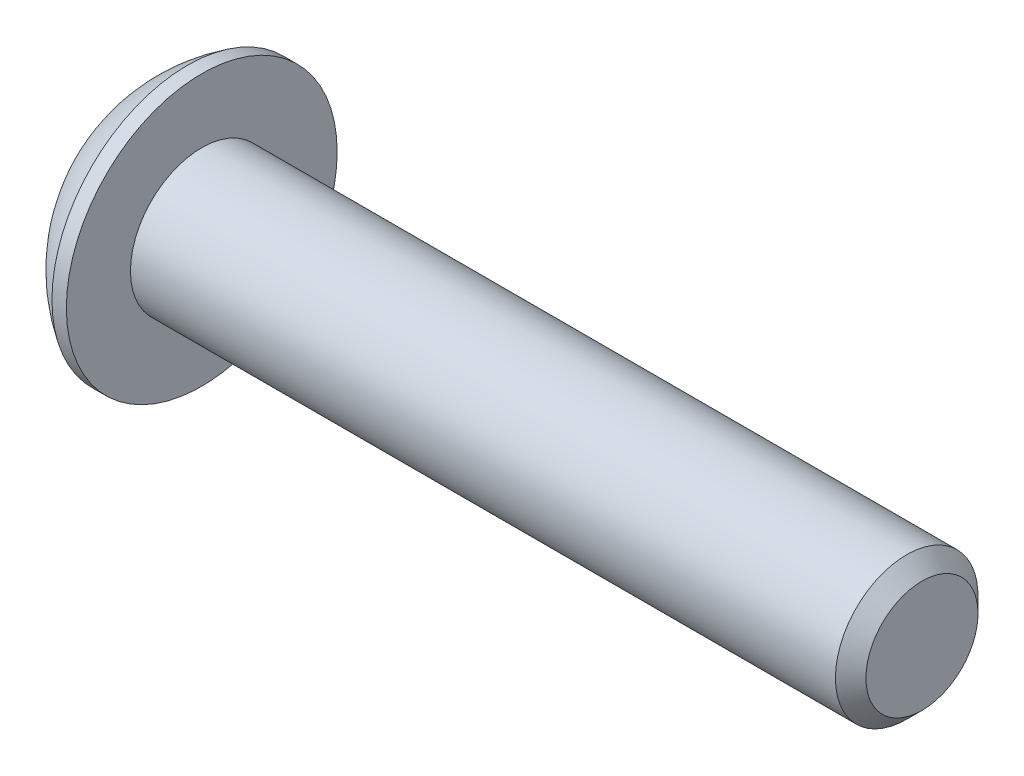
ISO-10303-21;
HEADER;
FILE_DESCRIPTION(('STEP AP214'),'2;1');
FILE_NAME('part.step','',(''),(''),'','','');
FILE_SCHEMA(('AUTOMOTIVE_DESIGN { 1 0 10303 214 1 1 1 1 }'));
ENDSEC;
DATA;
#1=APPLICATION_CONTEXT('core data for automotive mechanical design processes');
#2=APPLICATION_PROTOCOL_DEFINITION('international standard','automotive_design',2000,#1);
#3=PRODUCT_CONTEXT('',#1,'mechanical');
#4=PRODUCT('Part','Part','',(#3));
#5=PRODUCT_RELATED_PRODUCT_CATEGORY('part','',(#4));
#6=PRODUCT_DEFINITION_FORMATION('','',#4);
#7=PRODUCT_DEFINITION_CONTEXT('part definition',#1,'design');
#8=PRODUCT_DEFINITION('design','',#6,#7);
#9=PRODUCT_DEFINITION_SHAPE('','',#8);
#10=(LENGTH_UNIT() NAMED_UNIT(*) SI_UNIT(.MILLI.,.METRE.));
#11=(NAMED_UNIT(*) PLANE_ANGLE_UNIT() SI_UNIT($,.RADIAN.));
#12=(NAMED_UNIT(*) SI_UNIT($,.STERADIAN.) SOLID_ANGLE_UNIT());
#13=UNCERTAINTY_MEASURE_WITH_UNIT(LENGTH_MEASURE(1.E-05),#10,'distance_accuracy_value','');
#14=(GEOMETRIC_REPRESENTATION_CONTEXT(3) GLOBAL_UNCERTAINTY_ASSIGNED_CONTEXT((#13)) GLOBAL_UNIT_ASSIGNED_CONTEXT((#10,
#11,#12)) REPRESENTATION_CONTEXT('',''));
#15=CARTESIAN_POINT('',(0.,0.,0.));
#16=DIRECTION('',(0.,0.,1.));
#17=DIRECTION('',(1.,0.,0.));
#18=AXIS2_PLACEMENT_3D('',#15,#16,#17);
#19=CARTESIAN_POINT('',(0.,0.,0.));
#20=DIRECTION('',(-1.,0.,0.));
#21=DIRECTION('',(0.,0.,1.));
#22=AXIS2_PLACEMENT_3D('',#19,#20,#21);
#23=PLANE('',#22);
#24=CARTESIAN_POINT('',(0.,0.,0.));
#25=DIRECTION('',(-1.,0.,0.));
#26=DIRECTION('',(0.,0.,1.));
#27=AXIS2_PLACEMENT_3D('',#24,#25,#26);
#28=CIRCLE('',#27,1.1938);
#29=CARTESIAN_POINT('',(0.,1.1938,0.));
#30=VERTEX_POINT('',#29);
#31=EDGE_CURVE('E11',#30,#30,#28,.T.);
#32=ORIENTED_EDGE('',*,*,#31,.T.);
#33=EDGE_LOOP('',(#32));
#34=FACE_BOUND('',#33,.T.);
#35=DIRECTION('',(0.,-1.,0.));
#36=VECTOR('',#35,1.);
#37=CARTESIAN_POINT('',(0.,-0.454605601959911,0.787400000000001));
#38=LINE('',#37,#36);
#39=CARTESIAN_POINT('',(0.,0.454605601959914,0.787400000000002));
#40=VERTEX_POINT('',#39);
#41=CARTESIAN_POINT('',(0.,-0.454605601959911,0.787400000000001));
#42=VERTEX_POINT('',#41);
#43=EDGE_CURVE('E51',#40,#42,#38,.T.);
#44=ORIENTED_EDGE('',*,*,#43,.T.);
#45=DIRECTION('',(0.,-0.499999999999998,-0.86602540378444));
#46=VECTOR('',#45,1.);
#47=CARTESIAN_POINT('',(0.,-0.90921120391982,0.));
#48=LINE('',#47,#46);
#49=CARTESIAN_POINT('',(0.,-0.90921120391982,0.));
#50=VERTEX_POINT('',#49);
#51=EDGE_CURVE('E370',#42,#50,#48,.T.);
#52=ORIENTED_EDGE('',*,*,#51,.T.);
#53=DIRECTION('',(0.,0.499999999999999,-0.866025403784439));
#54=VECTOR('',#53,1.);
#55=CARTESIAN_POINT('',(0.,-0.454605601959911,-0.7874));
#56=LINE('',#55,#54);
#57=CARTESIAN_POINT('',(0.,-0.454605601959911,-0.7874));
#58=VERTEX_POINT('',#57);
#59=EDGE_CURVE('E131',#50,#58,#56,.T.);
#60=ORIENTED_EDGE('',*,*,#59,.T.);
#61=DIRECTION('',(0.,1.,0.));
#62=VECTOR('',#61,1.);
#63=CARTESIAN_POINT('',(0.,0.454605601959914,-0.7874));
#64=LINE('',#63,#62);
#65=CARTESIAN_POINT('',(0.,0.454605601959914,-0.7874));
#66=VERTEX_POINT('',#65);
#67=EDGE_CURVE('E373',#58,#66,#64,.T.);
#68=ORIENTED_EDGE('',*,*,#67,.T.);
#69=DIRECTION('',(0.,0.5,0.866025403784439));
#70=VECTOR('',#69,1.);
#71=CARTESIAN_POINT('',(0.,0.909211203919825,0.));
#72=LINE('',#71,#70);
#73=CARTESIAN_POINT('',(0.,0.909211203919825,0.));
#74=VERTEX_POINT('',#73);
#75=EDGE_CURVE('E375',#66,#74,#72,.T.);
#76=ORIENTED_EDGE('',*,*,#75,.T.);
#77=DIRECTION('',(0.,-0.499999999999998,0.86602540378444));
#78=VECTOR('',#77,1.);
#79=CARTESIAN_POINT('',(0.,0.454605601959914,0.787400000000002));
#80=LINE('',#79,#78);
#81=EDGE_CURVE('E377',#74,#40,#80,.T.);
#82=ORIENTED_EDGE('',*,*,#81,.T.);
#83=EDGE_LOOP('',(#44,#52,#60,#68,#76,#82));
#84=FACE_BOUND('',#83,.T.);
#85=ADVANCED_FACE('F37',(#34,#84),#23,.T.);
#86=CARTESIAN_POINT('',(2.53727857142857,0.,0.));
#87=DIRECTION('',(-1.,0.,0.));
#88=DIRECTION('',(0.,1.,0.));
#89=AXIS2_PLACEMENT_3D('',#86,#87,#88);
#90=SPHERICAL_SURFACE('',#89,2.80409361274381);
#91=CARTESIAN_POINT('',(1.0668,0.,0.));
#92=DIRECTION('',(-1.,0.,0.));
#93=DIRECTION('',(0.,0.,1.));
#94=AXIS2_PLACEMENT_3D('',#91,#92,#93);
#95=CIRCLE('',#94,2.3876);
#96=CARTESIAN_POINT('',(1.0668,2.3876,0.));
#97=VERTEX_POINT('',#96);
#98=EDGE_CURVE('E44',#97,#97,#95,.T.);
#99=CARTESIAN_POINT('',(1.0668,2.3876,0.));
#100=CARTESIAN_POINT('',(1.05239959514986,2.37873107877504,0.));
#101=CARTESIAN_POINT('',(1.03807944648218,2.36973184753798,0.));
#102=CARTESIAN_POINT('',(1.0096043070437,2.35147577775036,0.));
#103=CARTESIAN_POINT('',(0.99544931627289,2.3422189391998,0.));
#104=CARTESIAN_POINT('',(0.967309138160108,2.32345066749592,0.));
#105=CARTESIAN_POINT('',(0.953323950818132,2.31393923434259,0.));
#106=CARTESIAN_POINT('',(0.92552795501619,2.29466489209172,0.));
#107=CARTESIAN_POINT('',(0.911717146556223,2.28490198299417,0.));
#108=CARTESIAN_POINT('',(0.884274430764817,2.2651278837873,0.));
#109=CARTESIAN_POINT('',(0.870642523433377,2.25511669367799,0.));
#110=CARTESIAN_POINT('',(0.843562072536132,2.23484931028554,0.));
#111=CARTESIAN_POINT('',(0.830113528970327,2.22459311700241,0.));
#112=CARTESIAN_POINT('',(0.803404208489969,2.20383908487543,0.));
#113=CARTESIAN_POINT('',(0.790143431575416,2.19334124603159,0.));
#114=CARTESIAN_POINT('',(0.763813985736857,2.17210735962349,0.));
#115=CARTESIAN_POINT('',(0.750745316812851,2.16137131205923,0.));
#116=CARTESIAN_POINT('',(0.724804365421771,2.13966452300491,0.));
#117=CARTESIAN_POINT('',(0.711932082954696,2.12869378151484,0.));
#118=CARTESIAN_POINT('',(0.686388118644883,2.1065211962467,0.));
#119=CARTESIAN_POINT('',(0.673716436802143,2.09531935246863,0.));
#120=CARTESIAN_POINT('',(0.648577822236573,2.07268822991904,0.));
#121=CARTESIAN_POINT('',(0.636110889513743,2.06125895114752,0.));
#122=CARTESIAN_POINT('',(0.611385854651764,2.0381767003646,0.));
#123=CARTESIAN_POINT('',(0.599127752512616,2.0265237283532,0.));
#124=CARTESIAN_POINT('',(0.574824391914264,2.00299790607728,0.));
#125=CARTESIAN_POINT('',(0.562779133455059,1.99112505581278,0.));
#126=CARTESIAN_POINT('',(0.538905403631389,1.96716336400193,0.));
#127=CARTESIAN_POINT('',(0.527076932266924,1.95507452245559,0.));
#128=CARTESIAN_POINT('',(0.503640649075091,1.93068480576426,0.));
#129=CARTESIAN_POINT('',(0.492032837247724,1.91838393061926,0.));
#130=CARTESIAN_POINT('',(0.469041673332227,1.89357417383,0.));
#131=CARTESIAN_POINT('',(0.457658321244097,1.88106529218574,0.));
#132=CARTESIAN_POINT('',(0.435119803524877,1.85584361759518,0.));
#133=CARTESIAN_POINT('',(0.423964637893787,1.84313082464889,0.));
#134=CARTESIAN_POINT('',(0.401886145102042,1.81750548940861,0.));
#135=CARTESIAN_POINT('',(0.390962817941387,1.80459294711464,0.));
#136=CARTESIAN_POINT('',(0.369351578203901,1.77857234052793,0.));
#137=CARTESIAN_POINT('',(0.358663665627069,1.76546427623519,0.));
#138=CARTESIAN_POINT('',(0.337526754099839,1.73905691701051,0.));
#139=CARTESIAN_POINT('',(0.327077755149442,1.72575762207855,0.));
#140=CARTESIAN_POINT('',(0.306422091701408,1.69897215554065,0.));
#141=CARTESIAN_POINT('',(0.296215427203771,1.68548598393471,0.));
#142=CARTESIAN_POINT('',(0.276047774151319,1.65833117919434,0.));
#143=CARTESIAN_POINT('',(0.266086785596504,1.64466254605991,0.));
#144=CARTESIAN_POINT('',(0.24641374548976,1.61714729314286,0.));
#145=CARTESIAN_POINT('',(0.236701693937832,1.60330067336024,0.));
#146=CARTESIAN_POINT('',(0.217529707398503,1.5754339802972,0.));
#147=CARTESIAN_POINT('',(0.208069772411104,1.56141390701678,0.));
#148=CARTESIAN_POINT('',(0.189405116026145,1.53320489689316,0.));
#149=CARTESIAN_POINT('',(0.180200394628586,1.51901596004995,0.));
#150=CARTESIAN_POINT('',(0.162049178887077,1.49047386802321,0.));
#151=CARTESIAN_POINT('',(0.153102684543128,1.47612071283968,0.));
#152=CARTESIAN_POINT('',(0.135470851866675,1.4472548831007,0.));
#153=CARTESIAN_POINT('',(0.126785513534171,1.43274220854525,0.));
#154=CARTESIAN_POINT('',(0.109678836216247,1.40356209131596,0.));
#155=CARTESIAN_POINT('',(0.101257497230827,1.38889464864212,0.));
#156=CARTESIAN_POINT('',(0.0846815759769831,1.35940979686978,0.));
#157=CARTESIAN_POINT('',(0.0765269937085597,1.34459238777127,0.));
#158=CARTESIAN_POINT('',(0.0604872541982148,1.31481245479173,0.));
#159=CARTESIAN_POINT('',(0.0526020969562932,1.2998499309107,0.));
#160=CARTESIAN_POINT('',(0.0371037940550261,1.26978466433695,0.));
#161=CARTESIAN_POINT('',(0.0294906483956804,1.25468192164425,0.));
#162=CARTESIAN_POINT('',(0.0145388420852368,1.22434117118901,0.));
#163=CARTESIAN_POINT('',(0.00720018143413873,1.20910316342649,0.));
#164=CARTESIAN_POINT('',(0.,1.1938,0.));
#165=B_SPLINE_CURVE_WITH_KNOTS('',3,(#99,#100,#101,#102,#103,#104,#105,#106,#107,#108,#109,#110,
#111,#112,#113,#114,#115,#116,#117,#118,#119,#120,#121,#122,#123,#124,#125,#126,#127,#128,#129,
#130,#131,#132,#133,#134,#135,#136,#137,#138,#139,#140,#141,#142,#143,#144,#145,#146,#147,#148,
#149,#150,#151,#152,#153,#154,#155,#156,#157,#158,#159,#160,#161,#162,#163,#164),.UNSPECIFIED.,
.F.,.F.,(4,2,2,2,2,2,2,2,2,2,2,2,2,2,2,2,2,2,2,2,2,2,2,2,2,2,2,2,2,2,2,2,4),(0.,
0.0507365202177079,0.101473040435416,0.152209560653124,0.202946080870832,0.25368260108854,
0.304419121306248,0.355155641523956,0.405892161741665,0.456628681959373,0.50736520217708,
0.558101722394789,0.608838242612497,0.659574762830205,0.710311283047913,0.761047803265621,
0.81178432348333,0.862520843701037,0.913257363918746,0.963993884136454,1.01473040435416,
1.06546692457187,1.11620344478958,1.16693996500729,1.21767648522499,1.2684130054427,
1.31914952566041,1.36988604587812,1.42062256609583,1.47135908631353,1.52209560653124,
1.57283212674895,1.62356864696666),.UNSPECIFIED.);
#166=EDGE_CURVE('BSEAM158',#97,#30,#165,.T.);
#167=ORIENTED_EDGE('',*,*,#98,.T.);
#168=ORIENTED_EDGE('',*,*,#31,.F.);
#169=ORIENTED_EDGE('',*,*,#166,.T.);
#170=ORIENTED_EDGE('',*,*,#166,.F.);
#171=EDGE_LOOP('',(#167,#169,#168,#170));
#172=FACE_BOUND('',#171,.T.);
#173=ADVANCED_FACE('F158',(#172),#90,.T.);
#174=CARTESIAN_POINT('',(0.,0.,0.));
#175=DIRECTION('',(-1.,0.,0.));
#176=DIRECTION('',(0.,0.,1.));
#177=AXIS2_PLACEMENT_3D('',#174,#175,#176);
#178=CYLINDRICAL_SURFACE('',#177,2.3876);
#179=ORIENTED_EDGE('',*,*,#98,.F.);
#180=EDGE_LOOP('',(#179));
#181=FACE_BOUND('',#180,.T.);
#182=CARTESIAN_POINT('',(1.3208,0.,0.));
#183=DIRECTION('',(-1.,0.,0.));
#184=DIRECTION('',(0.,0.,1.));
#185=AXIS2_PLACEMENT_3D('',#182,#183,#184);
#186=CIRCLE('',#185,2.3876);
#187=CARTESIAN_POINT('',(1.3208,0.,2.3876));
#188=VERTEX_POINT('',#187);
#189=EDGE_CURVE('E153',#188,#188,#186,.T.);
#190=ORIENTED_EDGE('',*,*,#189,.T.);
#191=EDGE_LOOP('',(#190));
#192=FACE_BOUND('',#191,.T.);
#193=ADVANCED_FACE('F161',(#181,#192),#178,.T.);
#194=CARTESIAN_POINT('',(1.3208,1.2573,0.));
#195=DIRECTION('',(-1.,0.,0.));
#196=DIRECTION('',(0.,0.,1.));
#197=AXIS2_PLACEMENT_3D('',#194,#195,#196);
#198=PLANE('',#197);
#199=ORIENTED_EDGE('',*,*,#189,.F.);
#200=EDGE_LOOP('',(#199));
#201=FACE_BOUND('',#200,.T.);
#202=CARTESIAN_POINT('',(1.3208,0.,0.));
#203=DIRECTION('',(-1.,0.,0.));
#204=DIRECTION('',(0.,0.,1.));
#205=AXIS2_PLACEMENT_3D('',#202,#203,#204);
#206=CIRCLE('',#205,1.2573);
#207=CARTESIAN_POINT('',(1.3208,0.,1.2573));
#208=VERTEX_POINT('',#207);
#209=EDGE_CURVE('E150',#208,#208,#206,.T.);
#210=ORIENTED_EDGE('',*,*,#209,.T.);
#211=EDGE_LOOP('',(#210));
#212=FACE_BOUND('',#211,.T.);
#213=ADVANCED_FACE('F164',(#201,#212),#198,.F.);
#214=CARTESIAN_POINT('',(0.,0.,0.));
#215=DIRECTION('',(-1.,0.,0.));
#216=DIRECTION('',(0.,0.,1.));
#217=AXIS2_PLACEMENT_3D('',#214,#215,#216);
#218=CYLINDRICAL_SURFACE('',#217,1.2573);
#219=ORIENTED_EDGE('',*,*,#209,.F.);
#220=EDGE_LOOP('',(#219));
#221=FACE_BOUND('',#220,.T.);
#222=CARTESIAN_POINT('',(13.75156,0.,0.));
#223=DIRECTION('',(-1.,0.,0.));
#224=DIRECTION('',(0.,0.,1.));
#225=AXIS2_PLACEMENT_3D('',#222,#223,#224);
#226=CIRCLE('',#225,1.2573);
#227=CARTESIAN_POINT('',(13.75156,0.,1.2573));
#228=VERTEX_POINT('',#227);
#229=EDGE_CURVE('E147',#228,#228,#226,.T.);
#230=ORIENTED_EDGE('',*,*,#229,.T.);
#231=EDGE_LOOP('',(#230));
#232=FACE_BOUND('',#231,.T.);
#233=ADVANCED_FACE('F170',(#221,#232),#218,.T.);
#234=CARTESIAN_POINT('',(14.0208,0.,0.));
#235=DIRECTION('',(-1.,0.,0.));
#236=DIRECTION('',(0.,0.,1.));
#237=AXIS2_PLACEMENT_3D('',#234,#235,#236);
#238=CONICAL_SURFACE('',#237,0.98806,0.785398163397451);
#239=ORIENTED_EDGE('',*,*,#229,.F.);
#240=EDGE_LOOP('',(#239));
#241=FACE_BOUND('',#240,.T.);
#242=CARTESIAN_POINT('',(14.0208,0.,0.));
#243=DIRECTION('',(-1.,0.,0.));
#244=DIRECTION('',(0.,0.,1.));
#245=AXIS2_PLACEMENT_3D('',#242,#243,#244);
#246=CIRCLE('',#245,0.98806);
#247=CARTESIAN_POINT('',(14.0208,0.,0.98806));
#248=VERTEX_POINT('',#247);
#249=EDGE_CURVE('E143',#248,#248,#246,.T.);
#250=ORIENTED_EDGE('',*,*,#249,.T.);
#251=EDGE_LOOP('',(#250));
#252=FACE_BOUND('',#251,.T.);
#253=ADVANCED_FACE('F176',(#241,#252),#238,.T.);
#254=CARTESIAN_POINT('',(14.0208,0.,0.));
#255=DIRECTION('',(-1.,0.,0.));
#256=DIRECTION('',(0.,0.,1.));
#257=AXIS2_PLACEMENT_3D('',#254,#255,#256);
#258=PLANE('',#257);
#259=ORIENTED_EDGE('',*,*,#249,.F.);
#260=EDGE_LOOP('',(#259));
#261=FACE_BOUND('',#260,.T.);
#262=ADVANCED_FACE('F182',(#261),#258,.F.);
#263=CARTESIAN_POINT('',(0.889,-0.90921120391982,0.));
#264=DIRECTION('',(0.,0.86602540378444,-0.499999999999998));
#265=DIRECTION('',(0.,0.499999999999998,0.86602540378444));
#266=AXIS2_PLACEMENT_3D('',#263,#264,#265);
#267=PLANE('',#266);
#268=DIRECTION('',(0.,-0.499999999999998,-0.86602540378444));
#269=VECTOR('',#268,1.);
#270=CARTESIAN_POINT('',(0.889,-0.90921120391982,0.));
#271=LINE('',#270,#269);
#272=CARTESIAN_POINT('',(0.889,-0.454605601959911,0.787400000000001));
#273=VERTEX_POINT('',#272);
#274=CARTESIAN_POINT('',(0.889,-0.681908402939867,0.393699999999998));
#275=VERTEX_POINT('',#274);
#276=EDGE_CURVE('E117',#273,#275,#271,.T.);
#277=ORIENTED_EDGE('',*,*,#276,.T.);
#278=CARTESIAN_POINT('',(0.889,-0.90921120391982,0.));
#279=VERTEX_POINT('',#278);
#280=EDGE_CURVE('E112',#275,#279,#271,.T.);
#281=ORIENTED_EDGE('',*,*,#280,.T.);
#282=DIRECTION('',(-1.,0.,0.));
#283=VECTOR('',#282,1.);
#284=CARTESIAN_POINT('',(0.889,-0.90921120391982,0.));
#285=LINE('',#284,#283);
#286=EDGE_CURVE('E114',#279,#50,#285,.T.);
#287=ORIENTED_EDGE('',*,*,#286,.T.);
#288=ORIENTED_EDGE('',*,*,#51,.F.);
#289=DIRECTION('',(-1.,0.,0.));
#290=VECTOR('',#289,1.);
#291=CARTESIAN_POINT('',(0.889,-0.454605601959911,0.787400000000001));
#292=LINE('',#291,#290);
#293=EDGE_CURVE('E365',#273,#42,#292,.T.);
#294=ORIENTED_EDGE('',*,*,#293,.F.);
#295=EDGE_LOOP('',(#277,#281,#287,#288,#294));
#296=FACE_BOUND('',#295,.T.);
#297=ADVANCED_FACE('F113',(#296),#267,.T.);
#298=CARTESIAN_POINT('',(0.889,-0.454605601959911,-0.7874));
#299=DIRECTION('',(0.,0.866025403784439,0.499999999999999));
#300=DIRECTION('',(0.,-0.499999999999999,0.866025403784439));
#301=AXIS2_PLACEMENT_3D('',#298,#299,#300);
#302=PLANE('',#301);
#303=DIRECTION('',(0.,0.499999999999999,-0.866025403784439));
#304=VECTOR('',#303,1.);
#305=CARTESIAN_POINT('',(0.889,-0.454605601959911,-0.7874));
#306=LINE('',#305,#304);
#307=CARTESIAN_POINT('',(0.889,-0.681908402939867,-0.393699999999999));
#308=VERTEX_POINT('',#307);
#309=EDGE_CURVE('E59',#279,#308,#306,.T.);
#310=ORIENTED_EDGE('',*,*,#309,.T.);
#311=CARTESIAN_POINT('',(0.889,-0.454605601959911,-0.7874));
#312=VERTEX_POINT('',#311);
#313=EDGE_CURVE('E126',#308,#312,#306,.T.);
#314=ORIENTED_EDGE('',*,*,#313,.T.);
#315=DIRECTION('',(-1.,0.,0.));
#316=VECTOR('',#315,1.);
#317=CARTESIAN_POINT('',(0.889,-0.454605601959911,-0.7874));
#318=LINE('',#317,#316);
#319=EDGE_CURVE('E133',#312,#58,#318,.T.);
#320=ORIENTED_EDGE('',*,*,#319,.T.);
#321=ORIENTED_EDGE('',*,*,#59,.F.);
#322=ORIENTED_EDGE('',*,*,#286,.F.);
#323=EDGE_LOOP('',(#310,#314,#320,#321,#322));
#324=FACE_BOUND('',#323,.T.);
#325=ADVANCED_FACE('F129',(#324),#302,.T.);
#326=CARTESIAN_POINT('',(0.889,0.454605601959914,-0.7874));
#327=DIRECTION('',(0.,0.,1.));
#328=DIRECTION('',(1.,0.,0.));
#329=AXIS2_PLACEMENT_3D('',#326,#327,#328);
#330=PLANE('',#329);
#331=DIRECTION('',(0.,1.,0.));
#332=VECTOR('',#331,1.);
#333=CARTESIAN_POINT('',(0.889,0.454605601959914,-0.7874));
#334=LINE('',#333,#332);
#335=CARTESIAN_POINT('',(0.889,0.,-0.7874));
#336=VERTEX_POINT('',#335);
#337=EDGE_CURVE('E395',#312,#336,#334,.T.);
#338=ORIENTED_EDGE('',*,*,#337,.T.);
#339=CARTESIAN_POINT('',(0.889,0.454605601959914,-0.7874));
#340=VERTEX_POINT('',#339);
#341=EDGE_CURVE('E125',#336,#340,#334,.T.);
#342=ORIENTED_EDGE('',*,*,#341,.T.);
#343=DIRECTION('',(-1.,0.,0.));
#344=VECTOR('',#343,1.);
#345=CARTESIAN_POINT('',(0.889,0.454605601959914,-0.7874));
#346=LINE('',#345,#344);
#347=EDGE_CURVE('E138',#340,#66,#346,.T.);
#348=ORIENTED_EDGE('',*,*,#347,.T.);
#349=ORIENTED_EDGE('',*,*,#67,.F.);
#350=ORIENTED_EDGE('',*,*,#319,.F.);
#351=EDGE_LOOP('',(#338,#342,#348,#349,#350));
#352=FACE_BOUND('',#351,.T.);
#353=ADVANCED_FACE('F244',(#352),#330,.T.);
#354=CARTESIAN_POINT('',(0.889,0.909211203919825,0.));
#355=DIRECTION('',(0.,-0.866025403784439,0.5));
#356=DIRECTION('',(0.,-0.5,-0.866025403784439));
#357=AXIS2_PLACEMENT_3D('',#354,#355,#356);
#358=PLANE('',#357);
#359=DIRECTION('',(0.,0.5,0.866025403784439));
#360=VECTOR('',#359,1.);
#361=CARTESIAN_POINT('',(0.889,0.909211203919825,0.));
#362=LINE('',#361,#360);
#363=CARTESIAN_POINT('',(0.889,0.681908402939869,-0.393700000000001));
#364=VERTEX_POINT('',#363);
#365=EDGE_CURVE('E399',#340,#364,#362,.T.);
#366=ORIENTED_EDGE('',*,*,#365,.T.);
#367=CARTESIAN_POINT('',(0.889,0.909211203919825,0.));
#368=VERTEX_POINT('',#367);
#369=EDGE_CURVE('E397',#364,#368,#362,.T.);
#370=ORIENTED_EDGE('',*,*,#369,.T.);
#371=DIRECTION('',(-1.,0.,0.));
#372=VECTOR('',#371,1.);
#373=CARTESIAN_POINT('',(0.889,0.909211203919825,0.));
#374=LINE('',#373,#372);
#375=EDGE_CURVE('E381',#368,#74,#374,.T.);
#376=ORIENTED_EDGE('',*,*,#375,.T.);
#377=ORIENTED_EDGE('',*,*,#75,.F.);
#378=ORIENTED_EDGE('',*,*,#347,.F.);
#379=EDGE_LOOP('',(#366,#370,#376,#377,#378));
#380=FACE_BOUND('',#379,.T.);
#381=ADVANCED_FACE('F253',(#380),#358,.T.);
#382=CARTESIAN_POINT('',(0.889,0.454605601959914,0.787400000000002));
#383=DIRECTION('',(0.,-0.86602540378444,-0.499999999999998));
#384=DIRECTION('',(0.,0.499999999999998,-0.86602540378444));
#385=AXIS2_PLACEMENT_3D('',#382,#383,#384);
#386=PLANE('',#385);
#387=DIRECTION('',(0.,-0.499999999999998,0.86602540378444));
#388=VECTOR('',#387,1.);
#389=CARTESIAN_POINT('',(0.889,0.454605601959914,0.787400000000002));
#390=LINE('',#389,#388);
#391=CARTESIAN_POINT('',(0.889,0.68190840293987,0.3937));
#392=VERTEX_POINT('',#391);
#393=EDGE_CURVE('E360',#368,#392,#390,.T.);
#394=ORIENTED_EDGE('',*,*,#393,.T.);
#395=CARTESIAN_POINT('',(0.889,0.454605601959914,0.787400000000002));
#396=VERTEX_POINT('',#395);
#397=EDGE_CURVE('E356',#392,#396,#390,.T.);
#398=ORIENTED_EDGE('',*,*,#397,.T.);
#399=DIRECTION('',(-1.,0.,0.));
#400=VECTOR('',#399,1.);
#401=CARTESIAN_POINT('',(0.889,0.454605601959914,0.787400000000002));
#402=LINE('',#401,#400);
#403=EDGE_CURVE('E364',#396,#40,#402,.T.);
#404=ORIENTED_EDGE('',*,*,#403,.T.);
#405=ORIENTED_EDGE('',*,*,#81,.F.);
#406=ORIENTED_EDGE('',*,*,#375,.F.);
#407=EDGE_LOOP('',(#394,#398,#404,#405,#406));
#408=FACE_BOUND('',#407,.T.);
#409=ADVANCED_FACE('F263',(#408),#386,.T.);
#410=CARTESIAN_POINT('',(0.889,-0.454605601959911,0.787400000000001));
#411=DIRECTION('',(0.,0.,-1.));
#412=DIRECTION('',(0.,1.,0.));
#413=AXIS2_PLACEMENT_3D('',#410,#411,#412);
#414=PLANE('',#413);
#415=DIRECTION('',(0.,-1.,0.));
#416=VECTOR('',#415,1.);
#417=CARTESIAN_POINT('',(0.889,-0.454605601959911,0.787400000000001));
#418=LINE('',#417,#416);
#419=CARTESIAN_POINT('',(0.889,0.,0.787400000000002));
#420=VERTEX_POINT('',#419);
#421=EDGE_CURVE('E355',#396,#420,#418,.T.);
#422=ORIENTED_EDGE('',*,*,#421,.T.);
#423=EDGE_CURVE('E358',#420,#273,#418,.T.);
#424=ORIENTED_EDGE('',*,*,#423,.T.);
#425=ORIENTED_EDGE('',*,*,#293,.T.);
#426=ORIENTED_EDGE('',*,*,#43,.F.);
#427=ORIENTED_EDGE('',*,*,#403,.F.);
#428=EDGE_LOOP('',(#422,#424,#425,#426,#427));
#429=FACE_BOUND('',#428,.T.);
#430=ADVANCED_FACE('F273',(#429),#414,.T.);
#431=CARTESIAN_POINT('',(0.889,-1.36381680587973,-0.7874));
#432=DIRECTION('',(1.,0.,0.));
#433=DIRECTION('',(0.,0.,-1.));
#434=AXIS2_PLACEMENT_3D('',#431,#432,#433);
#435=PLANE('',#434);
#436=CARTESIAN_POINT('',(0.889,0.,0.));
#437=DIRECTION('',(-1.,0.,0.));
#438=DIRECTION('',(0.,0.,1.));
#439=AXIS2_PLACEMENT_3D('',#436,#437,#438);
#440=CIRCLE('',#439,0.7874);
#441=EDGE_CURVE('E402',#364,#336,#440,.T.);
#442=ORIENTED_EDGE('',*,*,#441,.F.);
#443=ORIENTED_EDGE('',*,*,#365,.F.);
#444=ORIENTED_EDGE('',*,*,#341,.F.);
#445=EDGE_LOOP('',(#442,#443,#444));
#446=FACE_BOUND('',#445,.T.);
#447=ADVANCED_FACE('F283',(#446),#435,.F.);
#448=EDGE_CURVE('E144',#392,#364,#440,.T.);
#449=ORIENTED_EDGE('',*,*,#448,.F.);
#450=ORIENTED_EDGE('',*,*,#393,.F.);
#451=ORIENTED_EDGE('',*,*,#369,.F.);
#452=EDGE_LOOP('',(#449,#450,#451));
#453=FACE_BOUND('',#452,.T.);
#454=ADVANCED_FACE('F293',(#453),#435,.F.);
#455=EDGE_CURVE('E137',#420,#392,#440,.T.);
#456=ORIENTED_EDGE('',*,*,#455,.F.);
#457=ORIENTED_EDGE('',*,*,#421,.F.);
#458=ORIENTED_EDGE('',*,*,#397,.F.);
#459=EDGE_LOOP('',(#456,#457,#458));
#460=FACE_BOUND('',#459,.T.);
#461=ADVANCED_FACE('F304',(#460),#435,.F.);
#462=EDGE_CURVE('E132',#275,#420,#440,.T.);
#463=ORIENTED_EDGE('',*,*,#462,.F.);
#464=ORIENTED_EDGE('',*,*,#276,.F.);
#465=ORIENTED_EDGE('',*,*,#423,.F.);
#466=EDGE_LOOP('',(#463,#464,#465));
#467=FACE_BOUND('',#466,.T.);
#468=ADVANCED_FACE('F313',(#467),#435,.F.);
#469=EDGE_CURVE('E123',#308,#275,#440,.T.);
#470=ORIENTED_EDGE('',*,*,#469,.F.);
#471=ORIENTED_EDGE('',*,*,#309,.F.);
#472=ORIENTED_EDGE('',*,*,#280,.F.);
#473=EDGE_LOOP('',(#470,#471,#472));
#474=FACE_BOUND('',#473,.T.);
#475=ADVANCED_FACE('F122',(#474),#435,.F.);
#476=EDGE_CURVE('E396',#336,#308,#440,.T.);
#477=ORIENTED_EDGE('',*,*,#476,.F.);
#478=ORIENTED_EDGE('',*,*,#337,.F.);
#479=ORIENTED_EDGE('',*,*,#313,.F.);
#480=EDGE_LOOP('',(#477,#478,#479));
#481=FACE_BOUND('',#480,.T.);
#482=ADVANCED_FACE('F296',(#481),#435,.F.);
#483=CARTESIAN_POINT('',(1.34360560195992,0.,0.));
#484=DIRECTION('',(-1.,0.,0.));
#485=DIRECTION('',(0.,0.,1.));
#486=AXIS2_PLACEMENT_3D('',#483,#484,#485);
#487=CONICAL_SURFACE('',#486,0.,1.04719755119659);
#488=ORIENTED_EDGE('',*,*,#455,.T.);
#489=ORIENTED_EDGE('',*,*,#448,.T.);
#490=ORIENTED_EDGE('',*,*,#441,.T.);
#491=ORIENTED_EDGE('',*,*,#476,.T.);
#492=ORIENTED_EDGE('',*,*,#469,.T.);
#493=ORIENTED_EDGE('',*,*,#462,.T.);
#494=EDGE_LOOP('',(#488,#489,#490,#491,#492,#493));
#495=FACE_BOUND('',#494,.T.);
#496=CARTESIAN_POINT('',(1.34360560195992,0.,0.));
#497=VERTEX_POINT('',#496);
#498=VERTEX_LOOP('',#497);
#499=FACE_BOUND('',#498,.T.);
#500=ADVANCED_FACE('F337',(#495,#499),#487,.F.);
#501=CLOSED_SHELL('',(#85,#173,#193,#213,#233,#253,#262,#297,#325,#353,#381,#409,#430,#447,#454,
#461,#468,#475,#482,#500));
#502=MANIFOLD_SOLID_BREP('B2',#501);
#503=ADVANCED_BREP_SHAPE_REPRESENTATION('',(#18,#502),#14);
#504=SHAPE_DEFINITION_REPRESENTATION(#9,#503);
ENDSEC;
END-ISO-10303-21;
